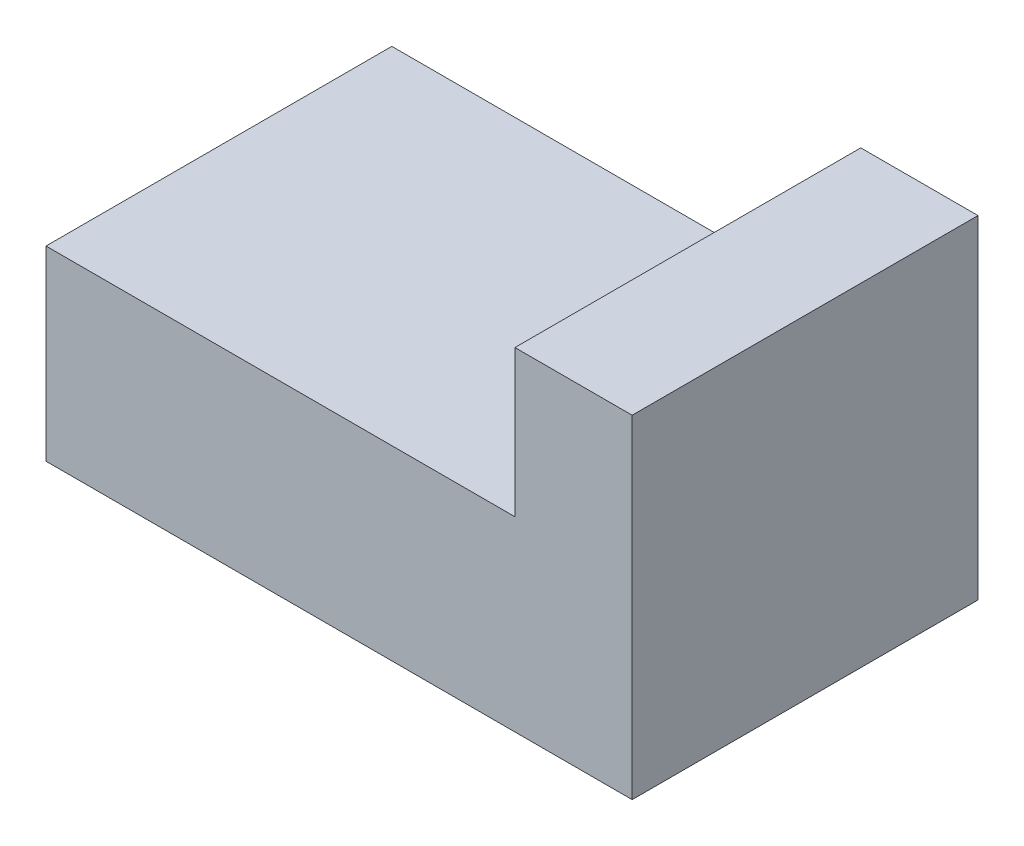
ISO-10303-21;
HEADER;
FILE_DESCRIPTION(('STEP AP214'),'2;1');
FILE_NAME('part.step','',(''),(''),'','','');
FILE_SCHEMA(('AUTOMOTIVE_DESIGN { 1 0 10303 214 1 1 1 1 }'));
ENDSEC;
DATA;
#1=APPLICATION_CONTEXT('core data for automotive mechanical design processes');
#2=APPLICATION_PROTOCOL_DEFINITION('international standard','automotive_design',2000,#1);
#3=PRODUCT_CONTEXT('',#1,'mechanical');
#4=PRODUCT('Part','Part','',(#3));
#5=PRODUCT_RELATED_PRODUCT_CATEGORY('part','',(#4));
#6=PRODUCT_DEFINITION_FORMATION('','',#4);
#7=PRODUCT_DEFINITION_CONTEXT('part definition',#1,'design');
#8=PRODUCT_DEFINITION('design','',#6,#7);
#9=PRODUCT_DEFINITION_SHAPE('','',#8);
#10=(LENGTH_UNIT() NAMED_UNIT(*) SI_UNIT(.MILLI.,.METRE.));
#11=(NAMED_UNIT(*) PLANE_ANGLE_UNIT() SI_UNIT($,.RADIAN.));
#12=(NAMED_UNIT(*) SI_UNIT($,.STERADIAN.) SOLID_ANGLE_UNIT());
#13=UNCERTAINTY_MEASURE_WITH_UNIT(LENGTH_MEASURE(1.E-05),#10,'distance_accuracy_value','');
#14=(GEOMETRIC_REPRESENTATION_CONTEXT(3) GLOBAL_UNCERTAINTY_ASSIGNED_CONTEXT((#13)) GLOBAL_UNIT_ASSIGNED_CONTEXT((#10,
#11,#12)) REPRESENTATION_CONTEXT('',''));
#15=CARTESIAN_POINT('',(0.,0.,0.));
#16=DIRECTION('',(0.,0.,1.));
#17=DIRECTION('',(1.,0.,0.));
#18=AXIS2_PLACEMENT_3D('',#15,#16,#17);
#19=CARTESIAN_POINT('',(0.,3.18,0.));
#20=DIRECTION('',(1.,0.,0.));
#21=DIRECTION('',(0.,0.,-1.));
#22=AXIS2_PLACEMENT_3D('',#19,#20,#21);
#23=PLANE('',#22);
#24=DIRECTION('',(0.,0.,1.));
#25=VECTOR('',#24,1.);
#26=CARTESIAN_POINT('',(0.,0.,0.));
#27=LINE('',#26,#25);
#28=CARTESIAN_POINT('',(0.,0.,0.));
#29=VERTEX_POINT('',#28);
#30=CARTESIAN_POINT('',(0.,0.,5.9));
#31=VERTEX_POINT('',#30);
#32=EDGE_CURVE('E97',#29,#31,#27,.T.);
#33=ORIENTED_EDGE('',*,*,#32,.T.);
#34=DIRECTION('',(0.,-1.,0.));
#35=VECTOR('',#34,1.);
#36=CARTESIAN_POINT('',(0.,3.18,5.9));
#37=LINE('',#36,#35);
#38=CARTESIAN_POINT('',(0.,3.18,5.9));
#39=VERTEX_POINT('',#38);
#40=EDGE_CURVE('E11',#39,#31,#37,.T.);
#41=ORIENTED_EDGE('',*,*,#40,.F.);
#42=DIRECTION('',(0.,0.,1.));
#43=VECTOR('',#42,1.);
#44=CARTESIAN_POINT('',(0.,3.18,0.));
#45=LINE('',#44,#43);
#46=CARTESIAN_POINT('',(0.,3.18,0.));
#47=VERTEX_POINT('',#46);
#48=EDGE_CURVE('E91',#47,#39,#45,.T.);
#49=ORIENTED_EDGE('',*,*,#48,.F.);
#50=DIRECTION('',(0.,-1.,0.));
#51=VECTOR('',#50,1.);
#52=CARTESIAN_POINT('',(0.,3.18,0.));
#53=LINE('',#52,#51);
#54=EDGE_CURVE('E82',#47,#29,#53,.T.);
#55=ORIENTED_EDGE('',*,*,#54,.T.);
#56=EDGE_LOOP('',(#33,#41,#49,#55));
#57=FACE_BOUND('',#56,.T.);
#58=ADVANCED_FACE('F39',(#57),#23,.F.);
#59=CARTESIAN_POINT('',(0.,3.18,5.9));
#60=DIRECTION('',(0.,0.,-1.));
#61=DIRECTION('',(-1.,0.,0.));
#62=AXIS2_PLACEMENT_3D('',#59,#60,#61);
#63=PLANE('',#62);
#64=DIRECTION('',(1.,0.,0.));
#65=VECTOR('',#64,1.);
#66=CARTESIAN_POINT('',(0.,0.,5.9));
#67=LINE('',#66,#65);
#68=CARTESIAN_POINT('',(10.,0.,5.9));
#69=VERTEX_POINT('',#68);
#70=EDGE_CURVE('E101',#31,#69,#67,.T.);
#71=ORIENTED_EDGE('',*,*,#70,.T.);
#72=DIRECTION('',(0.,-1.,0.));
#73=VECTOR('',#72,1.);
#74=CARTESIAN_POINT('',(10.,3.18,5.9));
#75=LINE('',#74,#73);
#76=CARTESIAN_POINT('',(10.,5.68,5.9));
#77=VERTEX_POINT('',#76);
#78=EDGE_CURVE('E47',#77,#69,#75,.T.);
#79=ORIENTED_EDGE('',*,*,#78,.F.);
#80=DIRECTION('',(1.,0.,0.));
#81=VECTOR('',#80,1.);
#82=CARTESIAN_POINT('',(10.,5.68,5.9));
#83=LINE('',#82,#81);
#84=CARTESIAN_POINT('',(8.,5.68,5.9));
#85=VERTEX_POINT('',#84);
#86=EDGE_CURVE('E131',#85,#77,#83,.T.);
#87=ORIENTED_EDGE('',*,*,#86,.F.);
#88=DIRECTION('',(0.,-1.,0.));
#89=VECTOR('',#88,1.);
#90=CARTESIAN_POINT('',(8.,5.68,5.9));
#91=LINE('',#90,#89);
#92=CARTESIAN_POINT('',(8.,3.18,5.9));
#93=VERTEX_POINT('',#92);
#94=EDGE_CURVE('E109',#85,#93,#91,.T.);
#95=ORIENTED_EDGE('',*,*,#94,.T.);
#96=DIRECTION('',(1.,0.,0.));
#97=VECTOR('',#96,1.);
#98=CARTESIAN_POINT('',(0.,3.18,5.9));
#99=LINE('',#98,#97);
#100=EDGE_CURVE('E153',#39,#93,#99,.T.);
#101=ORIENTED_EDGE('',*,*,#100,.F.);
#102=ORIENTED_EDGE('',*,*,#40,.T.);
#103=EDGE_LOOP('',(#71,#79,#87,#95,#101,#102));
#104=FACE_BOUND('',#103,.T.);
#105=ADVANCED_FACE('F128',(#104),#63,.F.);
#106=CARTESIAN_POINT('',(10.,3.18,0.));
#107=DIRECTION('',(-1.,0.,0.));
#108=DIRECTION('',(0.,0.,1.));
#109=AXIS2_PLACEMENT_3D('',#106,#107,#108);
#110=PLANE('',#109);
#111=DIRECTION('',(0.,0.,-1.));
#112=VECTOR('',#111,1.);
#113=CARTESIAN_POINT('',(10.,0.,0.));
#114=LINE('',#113,#112);
#115=CARTESIAN_POINT('',(10.,0.,0.));
#116=VERTEX_POINT('',#115);
#117=EDGE_CURVE('E92',#69,#116,#114,.T.);
#118=ORIENTED_EDGE('',*,*,#117,.T.);
#119=DIRECTION('',(0.,-1.,0.));
#120=VECTOR('',#119,1.);
#121=CARTESIAN_POINT('',(10.,3.18,0.));
#122=LINE('',#121,#120);
#123=CARTESIAN_POINT('',(10.,5.68,0.));
#124=VERTEX_POINT('',#123);
#125=EDGE_CURVE('E86',#124,#116,#122,.T.);
#126=ORIENTED_EDGE('',*,*,#125,.F.);
#127=DIRECTION('',(0.,0.,-1.));
#128=VECTOR('',#127,1.);
#129=CARTESIAN_POINT('',(10.,5.68,0.));
#130=LINE('',#129,#128);
#131=EDGE_CURVE('E124',#77,#124,#130,.T.);
#132=ORIENTED_EDGE('',*,*,#131,.F.);
#133=ORIENTED_EDGE('',*,*,#78,.T.);
#134=EDGE_LOOP('',(#118,#126,#132,#133));
#135=FACE_BOUND('',#134,.T.);
#136=ADVANCED_FACE('F122',(#135),#110,.F.);
#137=CARTESIAN_POINT('',(0.,3.18,0.));
#138=DIRECTION('',(0.,0.,1.));
#139=DIRECTION('',(1.,0.,0.));
#140=AXIS2_PLACEMENT_3D('',#137,#138,#139);
#141=PLANE('',#140);
#142=DIRECTION('',(-1.,0.,0.));
#143=VECTOR('',#142,1.);
#144=CARTESIAN_POINT('',(0.,0.,0.));
#145=LINE('',#144,#143);
#146=EDGE_CURVE('E79',#116,#29,#145,.T.);
#147=ORIENTED_EDGE('',*,*,#146,.T.);
#148=ORIENTED_EDGE('',*,*,#54,.F.);
#149=DIRECTION('',(-1.,0.,0.));
#150=VECTOR('',#149,1.);
#151=CARTESIAN_POINT('',(0.,3.18,0.));
#152=LINE('',#151,#150);
#153=CARTESIAN_POINT('',(8.,3.18,0.));
#154=VERTEX_POINT('',#153);
#155=EDGE_CURVE('E59',#154,#47,#152,.T.);
#156=ORIENTED_EDGE('',*,*,#155,.F.);
#157=DIRECTION('',(0.,-1.,0.));
#158=VECTOR('',#157,1.);
#159=CARTESIAN_POINT('',(8.,5.68,0.));
#160=LINE('',#159,#158);
#161=CARTESIAN_POINT('',(8.,5.68,0.));
#162=VERTEX_POINT('',#161);
#163=EDGE_CURVE('E103',#162,#154,#160,.T.);
#164=ORIENTED_EDGE('',*,*,#163,.F.);
#165=DIRECTION('',(-1.,0.,0.));
#166=VECTOR('',#165,1.);
#167=CARTESIAN_POINT('',(10.,5.68,0.));
#168=LINE('',#167,#166);
#169=EDGE_CURVE('E146',#124,#162,#168,.T.);
#170=ORIENTED_EDGE('',*,*,#169,.F.);
#171=ORIENTED_EDGE('',*,*,#125,.T.);
#172=EDGE_LOOP('',(#147,#148,#156,#164,#170,#171));
#173=FACE_BOUND('',#172,.T.);
#174=ADVANCED_FACE('F81',(#173),#141,.F.);
#175=CARTESIAN_POINT('',(0.,3.18,0.));
#176=DIRECTION('',(0.,1.,0.));
#177=DIRECTION('',(0.,0.,1.));
#178=AXIS2_PLACEMENT_3D('',#175,#176,#177);
#179=PLANE('',#178);
#180=DIRECTION('',(0.,0.,1.));
#181=VECTOR('',#180,1.);
#182=CARTESIAN_POINT('',(8.,3.18,0.));
#183=LINE('',#182,#181);
#184=EDGE_CURVE('E54',#154,#93,#183,.T.);
#185=ORIENTED_EDGE('',*,*,#184,.F.);
#186=ORIENTED_EDGE('',*,*,#155,.T.);
#187=ORIENTED_EDGE('',*,*,#48,.T.);
#188=ORIENTED_EDGE('',*,*,#100,.T.);
#189=EDGE_LOOP('',(#185,#186,#187,#188));
#190=FACE_BOUND('',#189,.T.);
#191=ADVANCED_FACE('F157',(#190),#179,.T.);
#192=CARTESIAN_POINT('',(0.,0.,0.));
#193=DIRECTION('',(0.,1.,0.));
#194=DIRECTION('',(0.,0.,1.));
#195=AXIS2_PLACEMENT_3D('',#192,#193,#194);
#196=PLANE('',#195);
#197=ORIENTED_EDGE('',*,*,#32,.F.);
#198=ORIENTED_EDGE('',*,*,#146,.F.);
#199=ORIENTED_EDGE('',*,*,#117,.F.);
#200=ORIENTED_EDGE('',*,*,#70,.F.);
#201=EDGE_LOOP('',(#197,#198,#199,#200));
#202=FACE_BOUND('',#201,.T.);
#203=ADVANCED_FACE('F100',(#202),#196,.F.);
#204=CARTESIAN_POINT('',(8.,5.68,0.));
#205=DIRECTION('',(1.,0.,0.));
#206=DIRECTION('',(0.,0.,-1.));
#207=AXIS2_PLACEMENT_3D('',#204,#205,#206);
#208=PLANE('',#207);
#209=ORIENTED_EDGE('',*,*,#184,.T.);
#210=ORIENTED_EDGE('',*,*,#94,.F.);
#211=DIRECTION('',(0.,0.,1.));
#212=VECTOR('',#211,1.);
#213=CARTESIAN_POINT('',(8.,5.68,0.));
#214=LINE('',#213,#212);
#215=EDGE_CURVE('E139',#162,#85,#214,.T.);
#216=ORIENTED_EDGE('',*,*,#215,.F.);
#217=ORIENTED_EDGE('',*,*,#163,.T.);
#218=EDGE_LOOP('',(#209,#210,#216,#217));
#219=FACE_BOUND('',#218,.T.);
#220=ADVANCED_FACE('F159',(#219),#208,.F.);
#221=CARTESIAN_POINT('',(0.,5.68,0.));
#222=DIRECTION('',(0.,-1.,0.));
#223=DIRECTION('',(0.,0.,-1.));
#224=AXIS2_PLACEMENT_3D('',#221,#222,#223);
#225=PLANE('',#224);
#226=ORIENTED_EDGE('',*,*,#131,.T.);
#227=ORIENTED_EDGE('',*,*,#169,.T.);
#228=ORIENTED_EDGE('',*,*,#215,.T.);
#229=ORIENTED_EDGE('',*,*,#86,.T.);
#230=EDGE_LOOP('',(#226,#227,#228,#229));
#231=FACE_BOUND('',#230,.T.);
#232=ADVANCED_FACE('F135',(#231),#225,.F.);
#233=CLOSED_SHELL('',(#58,#105,#136,#174,#191,#203,#220,#232));
#234=MANIFOLD_SOLID_BREP('B2',#233);
#235=ADVANCED_BREP_SHAPE_REPRESENTATION('',(#18,#234),#14);
#236=SHAPE_DEFINITION_REPRESENTATION(#9,#235);
ENDSEC;
END-ISO-10303-21;
